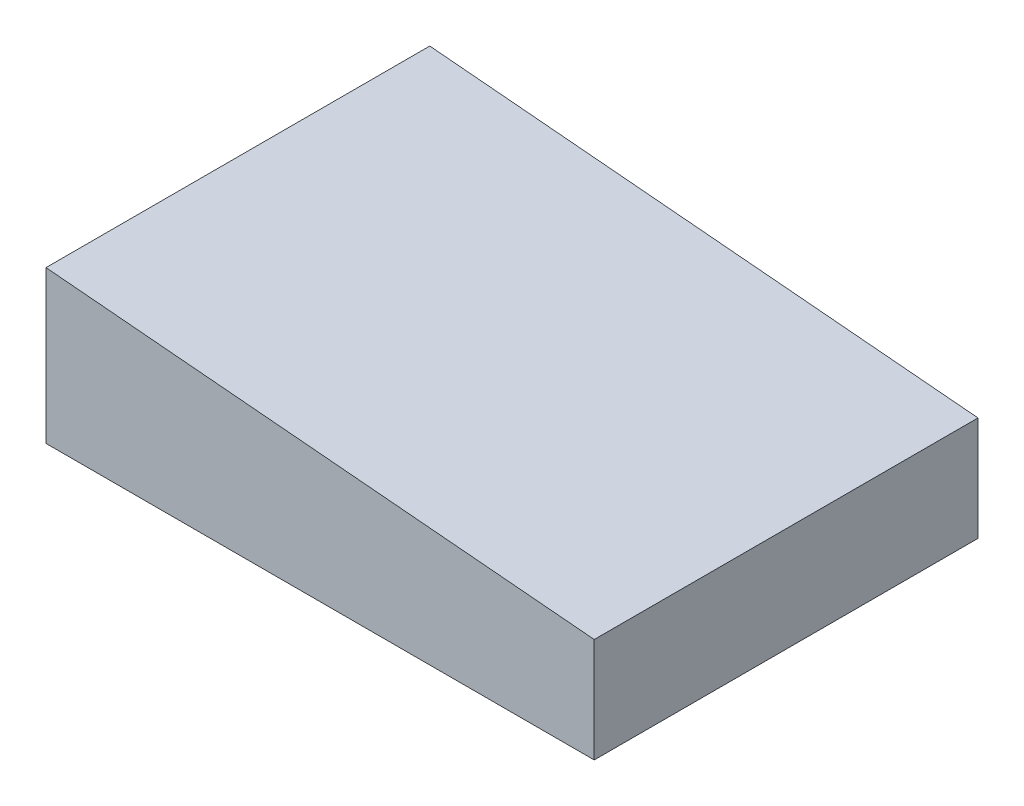
ISO-10303-21;
HEADER;
FILE_DESCRIPTION(('STEP AP214'),'2;1');
FILE_NAME('part.step','',(''),(''),'','','');
FILE_SCHEMA(('AUTOMOTIVE_DESIGN { 1 0 10303 214 1 1 1 1 }'));
ENDSEC;
DATA;
#1=APPLICATION_CONTEXT('core data for automotive mechanical design processes');
#2=APPLICATION_PROTOCOL_DEFINITION('international standard','automotive_design',2000,#1);
#3=PRODUCT_CONTEXT('',#1,'mechanical');
#4=PRODUCT('Part','Part','',(#3));
#5=PRODUCT_RELATED_PRODUCT_CATEGORY('part','',(#4));
#6=PRODUCT_DEFINITION_FORMATION('','',#4);
#7=PRODUCT_DEFINITION_CONTEXT('part definition',#1,'design');
#8=PRODUCT_DEFINITION('design','',#6,#7);
#9=PRODUCT_DEFINITION_SHAPE('','',#8);
#10=(LENGTH_UNIT() NAMED_UNIT(*) SI_UNIT(.MILLI.,.METRE.));
#11=(NAMED_UNIT(*) PLANE_ANGLE_UNIT() SI_UNIT($,.RADIAN.));
#12=(NAMED_UNIT(*) SI_UNIT($,.STERADIAN.) SOLID_ANGLE_UNIT());
#13=UNCERTAINTY_MEASURE_WITH_UNIT(LENGTH_MEASURE(1.E-05),#10,'distance_accuracy_value','');
#14=(GEOMETRIC_REPRESENTATION_CONTEXT(3) GLOBAL_UNCERTAINTY_ASSIGNED_CONTEXT((#13)) GLOBAL_UNIT_ASSIGNED_CONTEXT((#10,
#11,#12)) REPRESENTATION_CONTEXT('',''));
#15=CARTESIAN_POINT('',(0.,0.,0.));
#16=DIRECTION('',(0.,0.,1.));
#17=DIRECTION('',(1.,0.,0.));
#18=AXIS2_PLACEMENT_3D('',#15,#16,#17);
#19=CARTESIAN_POINT('',(317.526852970736,0.,35.));
#20=DIRECTION('',(0.,1.,0.));
#21=DIRECTION('',(-1.,0.,0.));
#22=AXIS2_PLACEMENT_3D('',#19,#20,#21);
#23=PLANE('',#22);
#24=CARTESIAN_POINT('',(93.,0.,28.));
#25=DIRECTION('',(0.,-1.,0.));
#26=DIRECTION('',(1.,0.,0.));
#27=AXIS2_PLACEMENT_3D('',#24,#25,#26);
#28=CIRCLE('',#27,1.5);
#29=CARTESIAN_POINT('',(94.5,0.,28.));
#30=VERTEX_POINT('',#29);
#31=EDGE_CURVE('E111',#30,#30,#28,.T.);
#32=ORIENTED_EDGE('',*,*,#31,.F.);
#33=EDGE_LOOP('',(#32));
#34=FACE_BOUND('',#33,.T.);
#35=CARTESIAN_POINT('',(6.99999999999998,0.,-28.));
#36=DIRECTION('',(0.,-1.,0.));
#37=DIRECTION('',(1.,0.,0.));
#38=AXIS2_PLACEMENT_3D('',#35,#36,#37);
#39=CIRCLE('',#38,1.5);
#40=CARTESIAN_POINT('',(8.49999999999998,0.,-28.));
#41=VERTEX_POINT('',#40);
#42=EDGE_CURVE('E112',#41,#41,#39,.T.);
#43=ORIENTED_EDGE('',*,*,#42,.F.);
#44=EDGE_LOOP('',(#43));
#45=FACE_BOUND('',#44,.T.);
#46=CARTESIAN_POINT('',(93.,0.,-28.));
#47=DIRECTION('',(0.,-1.,0.));
#48=DIRECTION('',(1.,0.,0.));
#49=AXIS2_PLACEMENT_3D('',#46,#47,#48);
#50=CIRCLE('',#49,1.5);
#51=CARTESIAN_POINT('',(94.5,0.,-28.));
#52=VERTEX_POINT('',#51);
#53=EDGE_CURVE('E122',#52,#52,#50,.T.);
#54=ORIENTED_EDGE('',*,*,#53,.F.);
#55=EDGE_LOOP('',(#54));
#56=FACE_BOUND('',#55,.T.);
#57=CARTESIAN_POINT('',(6.99999999999998,0.,28.));
#58=DIRECTION('',(0.,-1.,0.));
#59=DIRECTION('',(1.,0.,0.));
#60=AXIS2_PLACEMENT_3D('',#57,#58,#59);
#61=CIRCLE('',#60,1.5);
#62=CARTESIAN_POINT('',(8.49999999999998,0.,28.));
#63=VERTEX_POINT('',#62);
#64=EDGE_CURVE('E104',#63,#63,#61,.T.);
#65=ORIENTED_EDGE('',*,*,#64,.F.);
#66=EDGE_LOOP('',(#65));
#67=FACE_BOUND('',#66,.T.);
#68=DIRECTION('',(1.,0.,0.));
#69=VECTOR('',#68,1.);
#70=CARTESIAN_POINT('',(317.526852970736,0.,-35.));
#71=LINE('',#70,#69);
#72=CARTESIAN_POINT('',(0.,0.,-35.));
#73=VERTEX_POINT('',#72);
#74=CARTESIAN_POINT('',(100.,0.,-35.));
#75=VERTEX_POINT('',#74);
#76=EDGE_CURVE('E85',#73,#75,#71,.T.);
#77=ORIENTED_EDGE('',*,*,#76,.T.);
#78=DIRECTION('',(0.,0.,-1.));
#79=VECTOR('',#78,1.);
#80=CARTESIAN_POINT('',(100.,0.,35.));
#81=LINE('',#80,#79);
#82=CARTESIAN_POINT('',(100.,0.,35.));
#83=VERTEX_POINT('',#82);
#84=EDGE_CURVE('E49',#83,#75,#81,.T.);
#85=ORIENTED_EDGE('',*,*,#84,.F.);
#86=DIRECTION('',(1.,0.,0.));
#87=VECTOR('',#86,1.);
#88=CARTESIAN_POINT('',(317.526852970736,0.,35.));
#89=LINE('',#88,#87);
#90=CARTESIAN_POINT('',(0.,0.,35.));
#91=VERTEX_POINT('',#90);
#92=EDGE_CURVE('E80',#91,#83,#89,.T.);
#93=ORIENTED_EDGE('',*,*,#92,.F.);
#94=DIRECTION('',(0.,0.,-1.));
#95=VECTOR('',#94,1.);
#96=CARTESIAN_POINT('',(0.,0.,35.));
#97=LINE('',#96,#95);
#98=EDGE_CURVE('E74',#91,#73,#97,.T.);
#99=ORIENTED_EDGE('',*,*,#98,.T.);
#100=EDGE_LOOP('',(#77,#85,#93,#99));
#101=FACE_BOUND('',#100,.T.);
#102=ADVANCED_FACE('F36',(#34,#45,#56,#67,#101),#23,.F.);
#103=CARTESIAN_POINT('',(0.,27.78,35.));
#104=DIRECTION('',(-0.0871557427476512,-0.996194698091746,0.));
#105=DIRECTION('',(0.996194698091746,-0.0871557427476512,0.));
#106=AXIS2_PLACEMENT_3D('',#103,#104,#105);
#107=PLANE('',#106);
#108=DIRECTION('',(-0.996194698091746,0.0871557427476512,0.));
#109=VECTOR('',#108,1.);
#110=CARTESIAN_POINT('',(0.,27.78,35.));
#111=LINE('',#110,#109);
#112=CARTESIAN_POINT('',(100.,19.0311336474083,35.));
#113=VERTEX_POINT('',#112);
#114=CARTESIAN_POINT('',(0.,27.78,35.));
#115=VERTEX_POINT('',#114);
#116=EDGE_CURVE('E96',#113,#115,#111,.T.);
#117=ORIENTED_EDGE('',*,*,#116,.F.);
#118=DIRECTION('',(0.,0.,-1.));
#119=VECTOR('',#118,1.);
#120=CARTESIAN_POINT('',(100.,19.0311336474083,35.));
#121=LINE('',#120,#119);
#122=CARTESIAN_POINT('',(100.,19.0311336474083,-35.));
#123=VERTEX_POINT('',#122);
#124=EDGE_CURVE('E88',#113,#123,#121,.T.);
#125=ORIENTED_EDGE('',*,*,#124,.T.);
#126=DIRECTION('',(-0.996194698091746,0.0871557427476512,0.));
#127=VECTOR('',#126,1.);
#128=CARTESIAN_POINT('',(0.,27.78,-35.));
#129=LINE('',#128,#127);
#130=CARTESIAN_POINT('',(0.,27.78,-35.));
#131=VERTEX_POINT('',#130);
#132=EDGE_CURVE('E81',#123,#131,#129,.T.);
#133=ORIENTED_EDGE('',*,*,#132,.T.);
#134=DIRECTION('',(0.,0.,-1.));
#135=VECTOR('',#134,1.);
#136=CARTESIAN_POINT('',(0.,27.78,35.));
#137=LINE('',#136,#135);
#138=EDGE_CURVE('E43',#115,#131,#137,.T.);
#139=ORIENTED_EDGE('',*,*,#138,.F.);
#140=EDGE_LOOP('',(#117,#125,#133,#139));
#141=FACE_BOUND('',#140,.T.);
#142=ADVANCED_FACE('F130',(#141),#107,.F.);
#143=CARTESIAN_POINT('',(0.,0.,35.));
#144=DIRECTION('',(1.,0.,0.));
#145=DIRECTION('',(0.,0.,-1.));
#146=AXIS2_PLACEMENT_3D('',#143,#144,#145);
#147=PLANE('',#146);
#148=DIRECTION('',(0.,-1.,0.));
#149=VECTOR('',#148,1.);
#150=CARTESIAN_POINT('',(0.,0.,-35.));
#151=LINE('',#150,#149);
#152=EDGE_CURVE('E71',#131,#73,#151,.T.);
#153=ORIENTED_EDGE('',*,*,#152,.T.);
#154=ORIENTED_EDGE('',*,*,#98,.F.);
#155=DIRECTION('',(0.,-1.,0.));
#156=VECTOR('',#155,1.);
#157=CARTESIAN_POINT('',(0.,0.,35.));
#158=LINE('',#157,#156);
#159=EDGE_CURVE('E58',#115,#91,#158,.T.);
#160=ORIENTED_EDGE('',*,*,#159,.F.);
#161=ORIENTED_EDGE('',*,*,#138,.T.);
#162=EDGE_LOOP('',(#153,#154,#160,#161));
#163=FACE_BOUND('',#162,.T.);
#164=ADVANCED_FACE('F73',(#163),#147,.F.);
#165=CARTESIAN_POINT('',(0.,0.,35.));
#166=DIRECTION('',(0.,0.,-1.));
#167=DIRECTION('',(-1.,0.,0.));
#168=AXIS2_PLACEMENT_3D('',#165,#166,#167);
#169=PLANE('',#168);
#170=ORIENTED_EDGE('',*,*,#92,.T.);
#171=DIRECTION('',(0.,-1.,0.));
#172=VECTOR('',#171,1.);
#173=CARTESIAN_POINT('',(100.,70.,35.));
#174=LINE('',#173,#172);
#175=EDGE_CURVE('E92',#113,#83,#174,.T.);
#176=ORIENTED_EDGE('',*,*,#175,.F.);
#177=ORIENTED_EDGE('',*,*,#116,.T.);
#178=ORIENTED_EDGE('',*,*,#159,.T.);
#179=EDGE_LOOP('',(#170,#176,#177,#178));
#180=FACE_BOUND('',#179,.T.);
#181=ADVANCED_FACE('F149',(#180),#169,.F.);
#182=CARTESIAN_POINT('',(0.,0.,-35.));
#183=DIRECTION('',(0.,0.,-1.));
#184=DIRECTION('',(-1.,0.,0.));
#185=AXIS2_PLACEMENT_3D('',#182,#183,#184);
#186=PLANE('',#185);
#187=DIRECTION('',(0.,1.,0.));
#188=VECTOR('',#187,1.);
#189=CARTESIAN_POINT('',(100.,0.,-35.));
#190=LINE('',#189,#188);
#191=EDGE_CURVE('E12',#75,#123,#190,.T.);
#192=ORIENTED_EDGE('',*,*,#191,.F.);
#193=ORIENTED_EDGE('',*,*,#76,.F.);
#194=ORIENTED_EDGE('',*,*,#152,.F.);
#195=ORIENTED_EDGE('',*,*,#132,.F.);
#196=EDGE_LOOP('',(#192,#193,#194,#195));
#197=FACE_BOUND('',#196,.T.);
#198=ADVANCED_FACE('F87',(#197),#186,.T.);
#199=CARTESIAN_POINT('',(100.,70.,35.));
#200=DIRECTION('',(-1.,0.,0.));
#201=DIRECTION('',(0.,0.,1.));
#202=AXIS2_PLACEMENT_3D('',#199,#200,#201);
#203=PLANE('',#202);
#204=ORIENTED_EDGE('',*,*,#175,.T.);
#205=ORIENTED_EDGE('',*,*,#84,.T.);
#206=ORIENTED_EDGE('',*,*,#191,.T.);
#207=ORIENTED_EDGE('',*,*,#124,.F.);
#208=EDGE_LOOP('',(#204,#205,#206,#207));
#209=FACE_BOUND('',#208,.T.);
#210=ADVANCED_FACE('F137',(#209),#203,.F.);
#211=CARTESIAN_POINT('',(6.99999999999998,31.4068636288976,28.));
#212=DIRECTION('',(0.,-1.,0.));
#213=DIRECTION('',(1.,0.,0.));
#214=AXIS2_PLACEMENT_3D('',#211,#212,#213);
#215=CYLINDRICAL_SURFACE('',#214,1.5);
#216=CARTESIAN_POINT('',(6.99999999999998,24.1561198426885,28.));
#217=DIRECTION('',(-0.0871557427476512,-0.996194698091746,0.));
#218=DIRECTION('',(0.996194698091746,-0.0871557427476512,0.));
#219=AXIS2_PLACEMENT_3D('',#216,#217,#218);
#220=ELLIPSE('',#219,1.50572975631502,1.5);
#221=CARTESIAN_POINT('',(8.49999999999998,24.0248868473997,28.));
#222=VERTEX_POINT('',#221);
#223=EDGE_CURVE('E101',#222,#222,#220,.F.);
#224=ORIENTED_EDGE('',*,*,#223,.T.);
#225=EDGE_LOOP('',(#224));
#226=FACE_BOUND('',#225,.T.);
#227=ORIENTED_EDGE('',*,*,#64,.T.);
#228=EDGE_LOOP('',(#227));
#229=FACE_BOUND('',#228,.T.);
#230=ADVANCED_FACE('F134',(#226,#229),#215,.F.);
#231=CARTESIAN_POINT('',(-0.261467228242953,24.7914159057248,35.));
#232=DIRECTION('',(-0.0871557427476512,-0.996194698091746,0.));
#233=DIRECTION('',(0.996194698091746,-0.0871557427476512,0.));
#234=AXIS2_PLACEMENT_3D('',#231,#232,#233);
#235=PLANE('',#234);
#236=ORIENTED_EDGE('',*,*,#223,.F.);
#237=EDGE_LOOP('',(#236));
#238=FACE_BOUND('',#237,.T.);
#239=ADVANCED_FACE('F136',(#238),#235,.T.);
#240=CARTESIAN_POINT('',(93.,31.4068636288976,-28.));
#241=DIRECTION('',(0.,-1.,0.));
#242=DIRECTION('',(1.,0.,0.));
#243=AXIS2_PLACEMENT_3D('',#240,#241,#242);
#244=CYLINDRICAL_SURFACE('',#243,1.5);
#245=CARTESIAN_POINT('',(93.,16.6320947794597,-28.));
#246=DIRECTION('',(-0.0871557427476512,-0.996194698091746,0.));
#247=DIRECTION('',(0.996194698091746,-0.0871557427476512,0.));
#248=AXIS2_PLACEMENT_3D('',#245,#246,#247);
#249=ELLIPSE('',#248,1.50572975631502,1.5);
#250=CARTESIAN_POINT('',(94.5,16.5008617841708,-28.));
#251=VERTEX_POINT('',#250);
#252=EDGE_CURVE('E115',#251,#251,#249,.F.);
#253=ORIENTED_EDGE('',*,*,#252,.T.);
#254=EDGE_LOOP('',(#253));
#255=FACE_BOUND('',#254,.T.);
#256=ORIENTED_EDGE('',*,*,#53,.T.);
#257=EDGE_LOOP('',(#256));
#258=FACE_BOUND('',#257,.T.);
#259=ADVANCED_FACE('F126',(#255,#258),#244,.F.);
#260=CARTESIAN_POINT('',(-0.261467228242953,24.7914159057248,35.));
#261=DIRECTION('',(-0.0871557427476512,-0.996194698091746,0.));
#262=DIRECTION('',(0.996194698091746,-0.0871557427476512,0.));
#263=AXIS2_PLACEMENT_3D('',#260,#261,#262);
#264=PLANE('',#263);
#265=ORIENTED_EDGE('',*,*,#252,.F.);
#266=EDGE_LOOP('',(#265));
#267=FACE_BOUND('',#266,.T.);
#268=ADVANCED_FACE('F207',(#267),#264,.T.);
#269=CARTESIAN_POINT('',(6.99999999999998,31.4068636288976,-28.));
#270=DIRECTION('',(0.,-1.,0.));
#271=DIRECTION('',(1.,0.,0.));
#272=AXIS2_PLACEMENT_3D('',#269,#270,#271);
#273=CYLINDRICAL_SURFACE('',#272,1.5);
#274=CARTESIAN_POINT('',(6.99999999999998,24.1561198426885,-28.));
#275=DIRECTION('',(-0.0871557427476512,-0.996194698091746,0.));
#276=DIRECTION('',(0.996194698091746,-0.0871557427476512,0.));
#277=AXIS2_PLACEMENT_3D('',#274,#275,#276);
#278=ELLIPSE('',#277,1.50572975631502,1.5);
#279=CARTESIAN_POINT('',(8.49999999999998,24.0248868473997,-28.));
#280=VERTEX_POINT('',#279);
#281=EDGE_CURVE('E108',#280,#280,#278,.F.);
#282=ORIENTED_EDGE('',*,*,#281,.T.);
#283=EDGE_LOOP('',(#282));
#284=FACE_BOUND('',#283,.T.);
#285=ORIENTED_EDGE('',*,*,#42,.T.);
#286=EDGE_LOOP('',(#285));
#287=FACE_BOUND('',#286,.T.);
#288=ADVANCED_FACE('F217',(#284,#287),#273,.F.);
#289=CARTESIAN_POINT('',(-0.261467228242953,24.7914159057248,35.));
#290=DIRECTION('',(-0.0871557427476512,-0.996194698091746,0.));
#291=DIRECTION('',(0.996194698091746,-0.0871557427476512,0.));
#292=AXIS2_PLACEMENT_3D('',#289,#290,#291);
#293=PLANE('',#292);
#294=ORIENTED_EDGE('',*,*,#281,.F.);
#295=EDGE_LOOP('',(#294));
#296=FACE_BOUND('',#295,.T.);
#297=ADVANCED_FACE('F227',(#296),#293,.T.);
#298=CARTESIAN_POINT('',(93.,31.4068636288976,28.));
#299=DIRECTION('',(0.,-1.,0.));
#300=DIRECTION('',(1.,0.,0.));
#301=AXIS2_PLACEMENT_3D('',#298,#299,#300);
#302=CYLINDRICAL_SURFACE('',#301,1.5);
#303=CARTESIAN_POINT('',(93.,16.6320947794597,28.));
#304=DIRECTION('',(-0.0871557427476512,-0.996194698091746,0.));
#305=DIRECTION('',(0.996194698091746,-0.0871557427476512,0.));
#306=AXIS2_PLACEMENT_3D('',#303,#304,#305);
#307=ELLIPSE('',#306,1.50572975631502,1.5);
#308=CARTESIAN_POINT('',(94.5,16.5008617841708,28.));
#309=VERTEX_POINT('',#308);
#310=EDGE_CURVE('E107',#309,#309,#307,.F.);
#311=ORIENTED_EDGE('',*,*,#310,.T.);
#312=EDGE_LOOP('',(#311));
#313=FACE_BOUND('',#312,.T.);
#314=ORIENTED_EDGE('',*,*,#31,.T.);
#315=EDGE_LOOP('',(#314));
#316=FACE_BOUND('',#315,.T.);
#317=ADVANCED_FACE('F236',(#313,#316),#302,.F.);
#318=CARTESIAN_POINT('',(-0.261467228242953,24.7914159057248,35.));
#319=DIRECTION('',(-0.0871557427476512,-0.996194698091746,0.));
#320=DIRECTION('',(0.996194698091746,-0.0871557427476512,0.));
#321=AXIS2_PLACEMENT_3D('',#318,#319,#320);
#322=PLANE('',#321);
#323=ORIENTED_EDGE('',*,*,#310,.F.);
#324=EDGE_LOOP('',(#323));
#325=FACE_BOUND('',#324,.T.);
#326=ADVANCED_FACE('F246',(#325),#322,.T.);
#327=CLOSED_SHELL('',(#102,#142,#164,#181,#198,#210,#230,#239,#259,#268,#288,#297,#317,#326));
#328=MANIFOLD_SOLID_BREP('B2',#327);
#329=ADVANCED_BREP_SHAPE_REPRESENTATION('',(#18,#328),#14);
#330=SHAPE_DEFINITION_REPRESENTATION(#9,#329);
ENDSEC;
END-ISO-10303-21;
